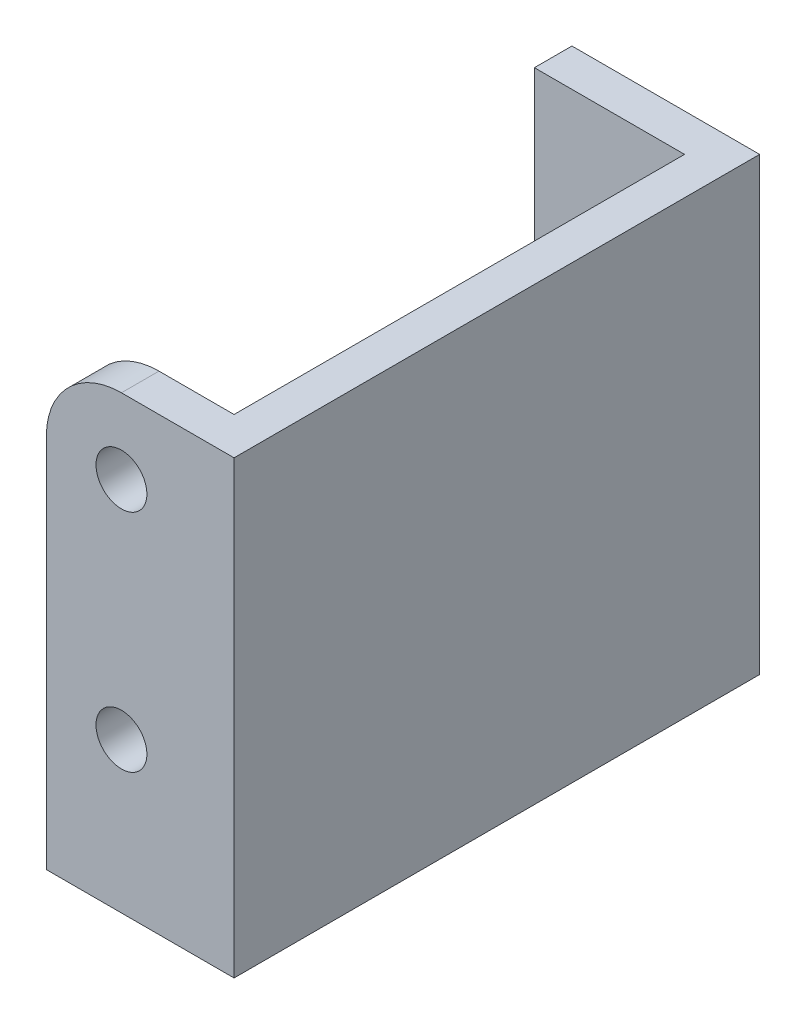
ISO-10303-21;
HEADER;
FILE_DESCRIPTION(('STEP AP214'),'2;1');
FILE_NAME('part.step','',(''),(''),'','','');
FILE_SCHEMA(('AUTOMOTIVE_DESIGN { 1 0 10303 214 1 1 1 1 }'));
ENDSEC;
DATA;
#1=APPLICATION_CONTEXT('core data for automotive mechanical design processes');
#2=APPLICATION_PROTOCOL_DEFINITION('international standard','automotive_design',2000,#1);
#3=PRODUCT_CONTEXT('',#1,'mechanical');
#4=PRODUCT('Part','Part','',(#3));
#5=PRODUCT_RELATED_PRODUCT_CATEGORY('part','',(#4));
#6=PRODUCT_DEFINITION_FORMATION('','',#4);
#7=PRODUCT_DEFINITION_CONTEXT('part definition',#1,'design');
#8=PRODUCT_DEFINITION('design','',#6,#7);
#9=PRODUCT_DEFINITION_SHAPE('','',#8);
#10=(LENGTH_UNIT() NAMED_UNIT(*) SI_UNIT(.MILLI.,.METRE.));
#11=(NAMED_UNIT(*) PLANE_ANGLE_UNIT() SI_UNIT($,.RADIAN.));
#12=(NAMED_UNIT(*) SI_UNIT($,.STERADIAN.) SOLID_ANGLE_UNIT());
#13=UNCERTAINTY_MEASURE_WITH_UNIT(LENGTH_MEASURE(1.E-05),#10,'distance_accuracy_value','');
#14=(GEOMETRIC_REPRESENTATION_CONTEXT(3) GLOBAL_UNCERTAINTY_ASSIGNED_CONTEXT((#13)) GLOBAL_UNIT_ASSIGNED_CONTEXT((#10,
#11,#12)) REPRESENTATION_CONTEXT('',''));
#15=CARTESIAN_POINT('',(0.,0.,0.));
#16=DIRECTION('',(0.,0.,1.));
#17=DIRECTION('',(1.,0.,0.));
#18=AXIS2_PLACEMENT_3D('',#15,#16,#17);
#19=CARTESIAN_POINT('',(-7.9375,19.05,-44.45));
#20=DIRECTION('',(-1.,0.,0.));
#21=DIRECTION('',(0.,-1.,0.));
#22=AXIS2_PLACEMENT_3D('',#19,#20,#21);
#23=PLANE('',#22);
#24=DIRECTION('',(0.,-1.,0.));
#25=VECTOR('',#24,1.);
#26=CARTESIAN_POINT('',(-7.9375,19.05,0.));
#27=LINE('',#26,#25);
#28=CARTESIAN_POINT('',(-7.9375,12.7,0.));
#29=VERTEX_POINT('',#28);
#30=CARTESIAN_POINT('',(-7.9375,-19.05,0.));
#31=VERTEX_POINT('',#30);
#32=EDGE_CURVE('E186',#29,#31,#27,.T.);
#33=ORIENTED_EDGE('',*,*,#32,.F.);
#34=DIRECTION('',(0.,0.,1.));
#35=VECTOR('',#34,1.);
#36=CARTESIAN_POINT('',(-7.9375,12.7,-44.45));
#37=LINE('',#36,#35);
#38=CARTESIAN_POINT('',(-7.9375,12.7,-3.175));
#39=VERTEX_POINT('',#38);
#40=EDGE_CURVE('E52',#29,#39,#37,.F.);
#41=ORIENTED_EDGE('',*,*,#40,.T.);
#42=DIRECTION('',(0.,-1.,0.));
#43=VECTOR('',#42,1.);
#44=CARTESIAN_POINT('',(-7.9375,0.,-3.175));
#45=LINE('',#44,#43);
#46=CARTESIAN_POINT('',(-7.9375,-15.875,-3.175));
#47=VERTEX_POINT('',#46);
#48=EDGE_CURVE('E154',#39,#47,#45,.T.);
#49=ORIENTED_EDGE('',*,*,#48,.T.);
#50=DIRECTION('',(0.,0.,1.));
#51=VECTOR('',#50,1.);
#52=CARTESIAN_POINT('',(-7.9375,-15.875,-44.45));
#53=LINE('',#52,#51);
#54=CARTESIAN_POINT('',(-7.9375,-15.875,-41.275));
#55=VERTEX_POINT('',#54);
#56=EDGE_CURVE('E127',#55,#47,#53,.T.);
#57=ORIENTED_EDGE('',*,*,#56,.F.);
#58=DIRECTION('',(0.,-1.,0.));
#59=VECTOR('',#58,1.);
#60=CARTESIAN_POINT('',(-7.9375,0.,-41.275));
#61=LINE('',#60,#59);
#62=CARTESIAN_POINT('',(-7.9375,19.05,-41.275));
#63=VERTEX_POINT('',#62);
#64=EDGE_CURVE('E141',#63,#55,#61,.T.);
#65=ORIENTED_EDGE('',*,*,#64,.F.);
#66=DIRECTION('',(0.,0.,1.));
#67=VECTOR('',#66,1.);
#68=CARTESIAN_POINT('',(-7.9375,19.05,-44.45));
#69=LINE('',#68,#67);
#70=CARTESIAN_POINT('',(-7.9375,19.05,-44.45));
#71=VERTEX_POINT('',#70);
#72=EDGE_CURVE('E200',#71,#63,#69,.T.);
#73=ORIENTED_EDGE('',*,*,#72,.F.);
#74=DIRECTION('',(0.,-1.,0.));
#75=VECTOR('',#74,1.);
#76=CARTESIAN_POINT('',(-7.9375,19.05,-44.45));
#77=LINE('',#76,#75);
#78=CARTESIAN_POINT('',(-7.9375,-19.05,-44.45));
#79=VERTEX_POINT('',#78);
#80=EDGE_CURVE('E171',#71,#79,#77,.T.);
#81=ORIENTED_EDGE('',*,*,#80,.T.);
#82=DIRECTION('',(0.,0.,1.));
#83=VECTOR('',#82,1.);
#84=CARTESIAN_POINT('',(-7.9375,-19.05,-44.45));
#85=LINE('',#84,#83);
#86=EDGE_CURVE('E196',#79,#31,#85,.T.);
#87=ORIENTED_EDGE('',*,*,#86,.T.);
#88=EDGE_LOOP('',(#33,#41,#49,#57,#65,#73,#81,#87));
#89=FACE_BOUND('',#88,.T.);
#90=ADVANCED_FACE('F43',(#89),#23,.T.);
#91=CARTESIAN_POINT('',(-7.9375,19.05,-44.45));
#92=DIRECTION('',(0.,1.,0.));
#93=DIRECTION('',(0.,0.,1.));
#94=AXIS2_PLACEMENT_3D('',#91,#92,#93);
#95=PLANE('',#94);
#96=DIRECTION('',(-1.,0.,0.));
#97=VECTOR('',#96,1.);
#98=CARTESIAN_POINT('',(0.,19.05,-3.175));
#99=LINE('',#98,#97);
#100=CARTESIAN_POINT('',(4.7625,19.05,-3.175));
#101=VERTEX_POINT('',#100);
#102=CARTESIAN_POINT('',(-1.5875,19.05,-3.175));
#103=VERTEX_POINT('',#102);
#104=EDGE_CURVE('E157',#101,#103,#99,.T.);
#105=ORIENTED_EDGE('',*,*,#104,.T.);
#106=DIRECTION('',(0.,0.,1.));
#107=VECTOR('',#106,1.);
#108=CARTESIAN_POINT('',(-1.5875,19.05,-44.45));
#109=LINE('',#108,#107);
#110=CARTESIAN_POINT('',(-1.5875,19.05,0.));
#111=VERTEX_POINT('',#110);
#112=EDGE_CURVE('E195',#103,#111,#109,.T.);
#113=ORIENTED_EDGE('',*,*,#112,.T.);
#114=DIRECTION('',(-1.,0.,0.));
#115=VECTOR('',#114,1.);
#116=CARTESIAN_POINT('',(-7.9375,19.05,0.));
#117=LINE('',#116,#115);
#118=CARTESIAN_POINT('',(7.9375,19.05,0.));
#119=VERTEX_POINT('',#118);
#120=EDGE_CURVE('E183',#119,#111,#117,.T.);
#121=ORIENTED_EDGE('',*,*,#120,.F.);
#122=DIRECTION('',(0.,0.,1.));
#123=VECTOR('',#122,1.);
#124=CARTESIAN_POINT('',(7.9375,19.05,-44.45));
#125=LINE('',#124,#123);
#126=CARTESIAN_POINT('',(7.9375,19.05,-44.45));
#127=VERTEX_POINT('',#126);
#128=EDGE_CURVE('E179',#127,#119,#125,.T.);
#129=ORIENTED_EDGE('',*,*,#128,.F.);
#130=DIRECTION('',(-1.,0.,0.));
#131=VECTOR('',#130,1.);
#132=CARTESIAN_POINT('',(-7.9375,19.05,-44.45));
#133=LINE('',#132,#131);
#134=EDGE_CURVE('E166',#127,#71,#133,.T.);
#135=ORIENTED_EDGE('',*,*,#134,.T.);
#136=ORIENTED_EDGE('',*,*,#72,.T.);
#137=DIRECTION('',(-1.,0.,0.));
#138=VECTOR('',#137,1.);
#139=CARTESIAN_POINT('',(0.,19.05,-41.275));
#140=LINE('',#139,#138);
#141=CARTESIAN_POINT('',(4.7625,19.05,-41.275));
#142=VERTEX_POINT('',#141);
#143=EDGE_CURVE('E137',#142,#63,#140,.T.);
#144=ORIENTED_EDGE('',*,*,#143,.F.);
#145=DIRECTION('',(0.,0.,1.));
#146=VECTOR('',#145,1.);
#147=CARTESIAN_POINT('',(4.7625,19.05,-44.45));
#148=LINE('',#147,#146);
#149=EDGE_CURVE('E133',#142,#101,#148,.T.);
#150=ORIENTED_EDGE('',*,*,#149,.T.);
#151=EDGE_LOOP('',(#105,#113,#121,#129,#135,#136,#144,#150));
#152=FACE_BOUND('',#151,.T.);
#153=ADVANCED_FACE('F214',(#152),#95,.T.);
#154=CARTESIAN_POINT('',(7.9375,19.05,-44.45));
#155=DIRECTION('',(1.,0.,0.));
#156=DIRECTION('',(0.,1.,0.));
#157=AXIS2_PLACEMENT_3D('',#154,#155,#156);
#158=PLANE('',#157);
#159=DIRECTION('',(0.,1.,0.));
#160=VECTOR('',#159,1.);
#161=CARTESIAN_POINT('',(7.9375,19.05,0.));
#162=LINE('',#161,#160);
#163=CARTESIAN_POINT('',(7.9375,-19.05,0.));
#164=VERTEX_POINT('',#163);
#165=EDGE_CURVE('E126',#164,#119,#162,.T.);
#166=ORIENTED_EDGE('',*,*,#165,.F.);
#167=DIRECTION('',(0.,0.,1.));
#168=VECTOR('',#167,1.);
#169=CARTESIAN_POINT('',(7.9375,-19.05,-44.45));
#170=LINE('',#169,#168);
#171=CARTESIAN_POINT('',(7.9375,-19.05,-44.45));
#172=VERTEX_POINT('',#171);
#173=EDGE_CURVE('E192',#172,#164,#170,.T.);
#174=ORIENTED_EDGE('',*,*,#173,.F.);
#175=DIRECTION('',(0.,1.,0.));
#176=VECTOR('',#175,1.);
#177=CARTESIAN_POINT('',(7.9375,19.05,-44.45));
#178=LINE('',#177,#176);
#179=EDGE_CURVE('E162',#172,#127,#178,.T.);
#180=ORIENTED_EDGE('',*,*,#179,.T.);
#181=ORIENTED_EDGE('',*,*,#128,.T.);
#182=EDGE_LOOP('',(#166,#174,#180,#181));
#183=FACE_BOUND('',#182,.T.);
#184=ADVANCED_FACE('F221',(#183),#158,.T.);
#185=CARTESIAN_POINT('',(-7.9375,-19.05,-44.45));
#186=DIRECTION('',(0.,-1.,0.));
#187=DIRECTION('',(0.,0.,-1.));
#188=AXIS2_PLACEMENT_3D('',#185,#186,#187);
#189=PLANE('',#188);
#190=DIRECTION('',(1.,0.,0.));
#191=VECTOR('',#190,1.);
#192=CARTESIAN_POINT('',(-7.9375,-19.05,0.));
#193=LINE('',#192,#191);
#194=EDGE_CURVE('E167',#31,#164,#193,.T.);
#195=ORIENTED_EDGE('',*,*,#194,.F.);
#196=ORIENTED_EDGE('',*,*,#86,.F.);
#197=DIRECTION('',(1.,0.,0.));
#198=VECTOR('',#197,1.);
#199=CARTESIAN_POINT('',(-7.9375,-19.05,-44.45));
#200=LINE('',#199,#198);
#201=EDGE_CURVE('E175',#79,#172,#200,.T.);
#202=ORIENTED_EDGE('',*,*,#201,.T.);
#203=ORIENTED_EDGE('',*,*,#173,.T.);
#204=EDGE_LOOP('',(#195,#196,#202,#203));
#205=FACE_BOUND('',#204,.T.);
#206=ADVANCED_FACE('F273',(#205),#189,.T.);
#207=CARTESIAN_POINT('',(0.,0.,-44.45));
#208=DIRECTION('',(0.,0.,1.));
#209=DIRECTION('',(1.,0.,0.));
#210=AXIS2_PLACEMENT_3D('',#207,#208,#209);
#211=PLANE('',#210);
#212=ORIENTED_EDGE('',*,*,#179,.F.);
#213=ORIENTED_EDGE('',*,*,#201,.F.);
#214=ORIENTED_EDGE('',*,*,#80,.F.);
#215=ORIENTED_EDGE('',*,*,#134,.F.);
#216=EDGE_LOOP('',(#212,#213,#214,#215));
#217=FACE_BOUND('',#216,.T.);
#218=ADVANCED_FACE('F226',(#217),#211,.F.);
#219=CARTESIAN_POINT('',(0.,0.,0.));
#220=DIRECTION('',(0.,0.,1.));
#221=DIRECTION('',(1.,0.,0.));
#222=AXIS2_PLACEMENT_3D('',#219,#220,#221);
#223=PLANE('',#222);
#224=CARTESIAN_POINT('',(-1.5875,-6.35000000000001,0.));
#225=DIRECTION('',(0.,0.,1.));
#226=DIRECTION('',(1.,0.,0.));
#227=AXIS2_PLACEMENT_3D('',#224,#225,#226);
#228=CIRCLE('',#227,2.15265);
#229=CARTESIAN_POINT('',(0.565149999999998,-6.35000000000001,0.));
#230=VERTEX_POINT('',#229);
#231=EDGE_CURVE('E237',#230,#230,#228,.T.);
#232=ORIENTED_EDGE('',*,*,#231,.F.);
#233=EDGE_LOOP('',(#232));
#234=FACE_BOUND('',#233,.T.);
#235=CARTESIAN_POINT('',(-1.5875,12.7,0.));
#236=DIRECTION('',(0.,0.,1.));
#237=DIRECTION('',(1.,0.,0.));
#238=AXIS2_PLACEMENT_3D('',#235,#236,#237);
#239=CIRCLE('',#238,2.15265);
#240=CARTESIAN_POINT('',(0.565149999999997,12.7,0.));
#241=VERTEX_POINT('',#240);
#242=EDGE_CURVE('E241',#241,#241,#239,.T.);
#243=ORIENTED_EDGE('',*,*,#242,.F.);
#244=EDGE_LOOP('',(#243));
#245=FACE_BOUND('',#244,.T.);
#246=ORIENTED_EDGE('',*,*,#120,.T.);
#247=CARTESIAN_POINT('',(-1.5875,12.7,0.));
#248=DIRECTION('',(0.,0.,1.));
#249=DIRECTION('',(1.,0.,0.));
#250=AXIS2_PLACEMENT_3D('',#247,#248,#249);
#251=CIRCLE('',#250,6.35);
#252=EDGE_CURVE('E66',#111,#29,#251,.T.);
#253=ORIENTED_EDGE('',*,*,#252,.T.);
#254=ORIENTED_EDGE('',*,*,#32,.T.);
#255=ORIENTED_EDGE('',*,*,#194,.T.);
#256=ORIENTED_EDGE('',*,*,#165,.T.);
#257=EDGE_LOOP('',(#246,#253,#254,#255,#256));
#258=FACE_BOUND('',#257,.T.);
#259=ADVANCED_FACE('F217',(#234,#245,#258),#223,.T.);
#260=CARTESIAN_POINT('',(4.7625,19.05,-44.45));
#261=DIRECTION('',(1.,0.,0.));
#262=DIRECTION('',(0.,1.,0.));
#263=AXIS2_PLACEMENT_3D('',#260,#261,#262);
#264=PLANE('',#263);
#265=DIRECTION('',(0.,1.,0.));
#266=VECTOR('',#265,1.);
#267=CARTESIAN_POINT('',(4.7625,0.,-3.175));
#268=LINE('',#267,#266);
#269=CARTESIAN_POINT('',(4.7625,-15.875,-3.175));
#270=VERTEX_POINT('',#269);
#271=EDGE_CURVE('E161',#270,#101,#268,.T.);
#272=ORIENTED_EDGE('',*,*,#271,.T.);
#273=ORIENTED_EDGE('',*,*,#149,.F.);
#274=DIRECTION('',(0.,1.,0.));
#275=VECTOR('',#274,1.);
#276=CARTESIAN_POINT('',(4.7625,0.,-41.275));
#277=LINE('',#276,#275);
#278=CARTESIAN_POINT('',(4.7625,-15.875,-41.275));
#279=VERTEX_POINT('',#278);
#280=EDGE_CURVE('E130',#279,#142,#277,.T.);
#281=ORIENTED_EDGE('',*,*,#280,.F.);
#282=DIRECTION('',(0.,0.,1.));
#283=VECTOR('',#282,1.);
#284=CARTESIAN_POINT('',(4.7625,-15.875,-44.45));
#285=LINE('',#284,#283);
#286=EDGE_CURVE('E113',#279,#270,#285,.T.);
#287=ORIENTED_EDGE('',*,*,#286,.T.);
#288=EDGE_LOOP('',(#272,#273,#281,#287));
#289=FACE_BOUND('',#288,.T.);
#290=ADVANCED_FACE('F131',(#289),#264,.F.);
#291=CARTESIAN_POINT('',(-7.9375,-15.875,-44.45));
#292=DIRECTION('',(0.,-1.,0.));
#293=DIRECTION('',(0.,0.,-1.));
#294=AXIS2_PLACEMENT_3D('',#291,#292,#293);
#295=PLANE('',#294);
#296=DIRECTION('',(1.,0.,0.));
#297=VECTOR('',#296,1.);
#298=CARTESIAN_POINT('',(0.,-15.875,-3.175));
#299=LINE('',#298,#297);
#300=EDGE_CURVE('E121',#47,#270,#299,.T.);
#301=ORIENTED_EDGE('',*,*,#300,.T.);
#302=ORIENTED_EDGE('',*,*,#286,.F.);
#303=DIRECTION('',(1.,0.,0.));
#304=VECTOR('',#303,1.);
#305=CARTESIAN_POINT('',(0.,-15.875,-41.275));
#306=LINE('',#305,#304);
#307=EDGE_CURVE('E118',#55,#279,#306,.T.);
#308=ORIENTED_EDGE('',*,*,#307,.F.);
#309=ORIENTED_EDGE('',*,*,#56,.T.);
#310=EDGE_LOOP('',(#301,#302,#308,#309));
#311=FACE_BOUND('',#310,.T.);
#312=ADVANCED_FACE('F115',(#311),#295,.F.);
#313=CARTESIAN_POINT('',(0.,0.,-41.275));
#314=DIRECTION('',(0.,0.,1.));
#315=DIRECTION('',(1.,0.,0.));
#316=AXIS2_PLACEMENT_3D('',#313,#314,#315);
#317=PLANE('',#316);
#318=ORIENTED_EDGE('',*,*,#280,.T.);
#319=ORIENTED_EDGE('',*,*,#143,.T.);
#320=ORIENTED_EDGE('',*,*,#64,.T.);
#321=ORIENTED_EDGE('',*,*,#307,.T.);
#322=EDGE_LOOP('',(#318,#319,#320,#321));
#323=FACE_BOUND('',#322,.T.);
#324=ADVANCED_FACE('F139',(#323),#317,.T.);
#325=CARTESIAN_POINT('',(0.,0.,-3.175));
#326=DIRECTION('',(0.,0.,1.));
#327=DIRECTION('',(1.,0.,0.));
#328=AXIS2_PLACEMENT_3D('',#325,#326,#327);
#329=PLANE('',#328);
#330=CARTESIAN_POINT('',(-1.5875,-6.35000000000001,-3.175));
#331=DIRECTION('',(0.,0.,1.));
#332=DIRECTION('',(1.,0.,0.));
#333=AXIS2_PLACEMENT_3D('',#330,#331,#332);
#334=CIRCLE('',#333,2.15265);
#335=CARTESIAN_POINT('',(0.565149999999998,-6.35000000000001,-3.175));
#336=VERTEX_POINT('',#335);
#337=EDGE_CURVE('E233',#336,#336,#334,.F.);
#338=ORIENTED_EDGE('',*,*,#337,.F.);
#339=EDGE_LOOP('',(#338));
#340=FACE_BOUND('',#339,.T.);
#341=CARTESIAN_POINT('',(-1.5875,12.7,-3.175));
#342=DIRECTION('',(0.,0.,1.));
#343=DIRECTION('',(1.,0.,0.));
#344=AXIS2_PLACEMENT_3D('',#341,#342,#343);
#345=CIRCLE('',#344,2.15265);
#346=CARTESIAN_POINT('',(0.565149999999997,12.7,-3.175));
#347=VERTEX_POINT('',#346);
#348=EDGE_CURVE('E245',#347,#347,#345,.F.);
#349=ORIENTED_EDGE('',*,*,#348,.F.);
#350=EDGE_LOOP('',(#349));
#351=FACE_BOUND('',#350,.T.);
#352=ORIENTED_EDGE('',*,*,#48,.F.);
#353=CARTESIAN_POINT('',(-1.5875,12.7,-3.175));
#354=DIRECTION('',(0.,0.,1.));
#355=DIRECTION('',(1.,0.,0.));
#356=AXIS2_PLACEMENT_3D('',#353,#354,#355);
#357=CIRCLE('',#356,6.35);
#358=EDGE_CURVE('E11',#39,#103,#357,.F.);
#359=ORIENTED_EDGE('',*,*,#358,.T.);
#360=ORIENTED_EDGE('',*,*,#104,.F.);
#361=ORIENTED_EDGE('',*,*,#271,.F.);
#362=ORIENTED_EDGE('',*,*,#300,.F.);
#363=EDGE_LOOP('',(#352,#359,#360,#361,#362));
#364=FACE_BOUND('',#363,.T.);
#365=ADVANCED_FACE('F229',(#340,#351,#364),#329,.F.);
#366=CARTESIAN_POINT('',(-1.5875,12.7,-44.451));
#367=DIRECTION('',(0.,0.,1.));
#368=DIRECTION('',(1.,0.,0.));
#369=AXIS2_PLACEMENT_3D('',#366,#367,#368);
#370=CYLINDRICAL_SURFACE('',#369,2.15265);
#371=ORIENTED_EDGE('',*,*,#242,.T.);
#372=EDGE_LOOP('',(#371));
#373=FACE_BOUND('',#372,.T.);
#374=ORIENTED_EDGE('',*,*,#348,.T.);
#375=EDGE_LOOP('',(#374));
#376=FACE_BOUND('',#375,.T.);
#377=ADVANCED_FACE('F251',(#373,#376),#370,.F.);
#378=CARTESIAN_POINT('',(-1.5875,-6.35000000000001,-44.451));
#379=DIRECTION('',(0.,0.,1.));
#380=DIRECTION('',(1.,0.,0.));
#381=AXIS2_PLACEMENT_3D('',#378,#379,#380);
#382=CYLINDRICAL_SURFACE('',#381,2.15265);
#383=ORIENTED_EDGE('',*,*,#231,.T.);
#384=EDGE_LOOP('',(#383));
#385=FACE_BOUND('',#384,.T.);
#386=ORIENTED_EDGE('',*,*,#337,.T.);
#387=EDGE_LOOP('',(#386));
#388=FACE_BOUND('',#387,.T.);
#389=ADVANCED_FACE('F260',(#385,#388),#382,.F.);
#390=CARTESIAN_POINT('',(-1.5875,12.7,-44.45));
#391=DIRECTION('',(0.,0.,1.));
#392=DIRECTION('',(1.,0.,0.));
#393=AXIS2_PLACEMENT_3D('',#390,#391,#392);
#394=CYLINDRICAL_SURFACE('',#393,6.35);
#395=ORIENTED_EDGE('',*,*,#358,.F.);
#396=ORIENTED_EDGE('',*,*,#40,.F.);
#397=ORIENTED_EDGE('',*,*,#252,.F.);
#398=ORIENTED_EDGE('',*,*,#112,.F.);
#399=EDGE_LOOP('',(#395,#396,#397,#398));
#400=FACE_BOUND('',#399,.T.);
#401=ADVANCED_FACE('F45',(#400),#394,.T.);
#402=CLOSED_SHELL('',(#90,#153,#184,#206,#218,#259,#290,#312,#324,#365,#377,#389,#401));
#403=MANIFOLD_SOLID_BREP('B2',#402);
#404=ADVANCED_BREP_SHAPE_REPRESENTATION('',(#18,#403),#14);
#405=SHAPE_DEFINITION_REPRESENTATION(#9,#404);
ENDSEC;
END-ISO-10303-21;
